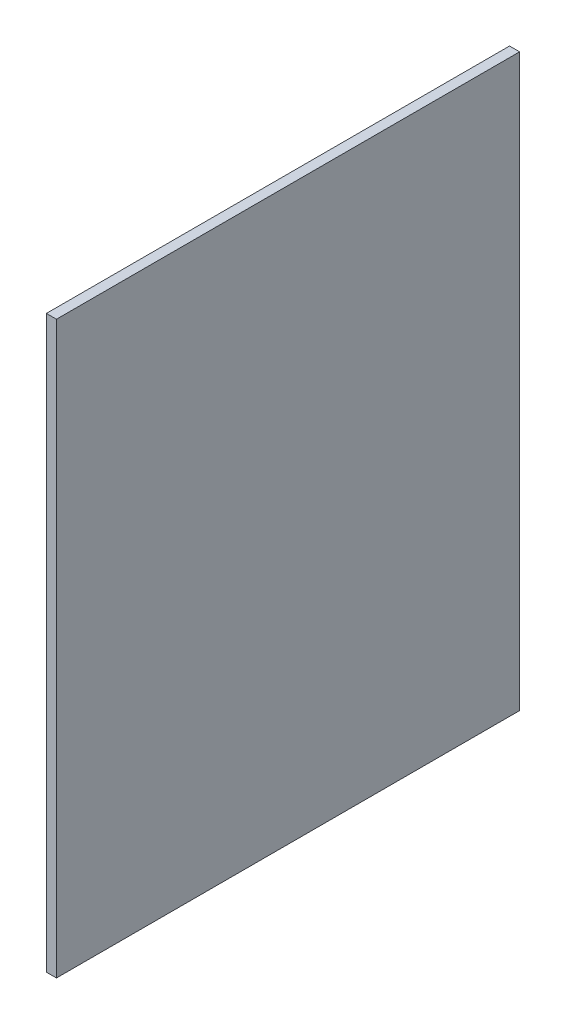
ISO-10303-21;
HEADER;
FILE_DESCRIPTION(('STEP AP214'),'2;1');
FILE_NAME('part.step','',(''),(''),'','','');
FILE_SCHEMA(('AUTOMOTIVE_DESIGN { 1 0 10303 214 1 1 1 1 }'));
ENDSEC;
DATA;
#1=APPLICATION_CONTEXT('core data for automotive mechanical design processes');
#2=APPLICATION_PROTOCOL_DEFINITION('international standard','automotive_design',2000,#1);
#3=PRODUCT_CONTEXT('',#1,'mechanical');
#4=PRODUCT('Part','Part','',(#3));
#5=PRODUCT_RELATED_PRODUCT_CATEGORY('part','',(#4));
#6=PRODUCT_DEFINITION_FORMATION('','',#4);
#7=PRODUCT_DEFINITION_CONTEXT('part definition',#1,'design');
#8=PRODUCT_DEFINITION('design','',#6,#7);
#9=PRODUCT_DEFINITION_SHAPE('','',#8);
#10=(LENGTH_UNIT() NAMED_UNIT(*) SI_UNIT(.MILLI.,.METRE.));
#11=(NAMED_UNIT(*) PLANE_ANGLE_UNIT() SI_UNIT($,.RADIAN.));
#12=(NAMED_UNIT(*) SI_UNIT($,.STERADIAN.) SOLID_ANGLE_UNIT());
#13=UNCERTAINTY_MEASURE_WITH_UNIT(LENGTH_MEASURE(1.E-05),#10,'distance_accuracy_value','');
#14=(GEOMETRIC_REPRESENTATION_CONTEXT(3) GLOBAL_UNCERTAINTY_ASSIGNED_CONTEXT((#13)) GLOBAL_UNIT_ASSIGNED_CONTEXT((#10,
#11,#12)) REPRESENTATION_CONTEXT('',''));
#15=CARTESIAN_POINT('',(0.,0.,0.));
#16=DIRECTION('',(0.,0.,1.));
#17=DIRECTION('',(1.,0.,0.));
#18=AXIS2_PLACEMENT_3D('',#15,#16,#17);
#19=CARTESIAN_POINT('',(19.05,-49.074997150076,36.486986728681));
#20=DIRECTION('',(0.,1.,0.));
#21=DIRECTION('',(0.,0.,1.));
#22=AXIS2_PLACEMENT_3D('',#19,#20,#21);
#23=PLANE('',#22);
#24=DIRECTION('',(0.,0.,-1.));
#25=VECTOR('',#24,1.);
#26=CARTESIAN_POINT('',(0.,-49.074997150076,36.486986728681));
#27=LINE('',#26,#25);
#28=CARTESIAN_POINT('',(0.,-49.074997150076,36.486986728681));
#29=VERTEX_POINT('',#28);
#30=CARTESIAN_POINT('',(0.,-49.074997150076,-839.813013271319));
#31=VERTEX_POINT('',#30);
#32=EDGE_CURVE('E99',#29,#31,#27,.T.);
#33=ORIENTED_EDGE('',*,*,#32,.T.);
#34=DIRECTION('',(-1.,0.,0.));
#35=VECTOR('',#34,1.);
#36=CARTESIAN_POINT('',(19.05,-49.074997150076,-839.813013271319));
#37=LINE('',#36,#35);
#38=CARTESIAN_POINT('',(19.05,-49.074997150076,-839.813013271319));
#39=VERTEX_POINT('',#38);
#40=EDGE_CURVE('E11',#39,#31,#37,.T.);
#41=ORIENTED_EDGE('',*,*,#40,.F.);
#42=DIRECTION('',(0.,0.,-1.));
#43=VECTOR('',#42,1.);
#44=CARTESIAN_POINT('',(19.05,-49.074997150076,36.486986728681));
#45=LINE('',#44,#43);
#46=CARTESIAN_POINT('',(19.05,-49.074997150076,36.486986728681));
#47=VERTEX_POINT('',#46);
#48=EDGE_CURVE('E76',#47,#39,#45,.T.);
#49=ORIENTED_EDGE('',*,*,#48,.F.);
#50=DIRECTION('',(-1.,0.,0.));
#51=VECTOR('',#50,1.);
#52=CARTESIAN_POINT('',(19.05,-49.074997150076,36.486986728681));
#53=LINE('',#52,#51);
#54=EDGE_CURVE('E95',#47,#29,#53,.T.);
#55=ORIENTED_EDGE('',*,*,#54,.T.);
#56=EDGE_LOOP('',(#33,#41,#49,#55));
#57=FACE_BOUND('',#56,.T.);
#58=ADVANCED_FACE('F37',(#57),#23,.F.);
#59=CARTESIAN_POINT('',(19.05,1030.42500284992,-839.813013271319));
#60=DIRECTION('',(0.,0.,-1.));
#61=DIRECTION('',(0.,1.,0.));
#62=AXIS2_PLACEMENT_3D('',#59,#60,#61);
#63=PLANE('',#62);
#64=DIRECTION('',(0.,-1.,0.));
#65=VECTOR('',#64,1.);
#66=CARTESIAN_POINT('',(0.,1030.42500284992,-839.813013271319));
#67=LINE('',#66,#65);
#68=CARTESIAN_POINT('',(0.,1030.42500284992,-839.813013271319));
#69=VERTEX_POINT('',#68);
#70=EDGE_CURVE('E85',#69,#31,#67,.T.);
#71=ORIENTED_EDGE('',*,*,#70,.F.);
#72=DIRECTION('',(-1.,0.,0.));
#73=VECTOR('',#72,1.);
#74=CARTESIAN_POINT('',(19.05,1030.42500284992,-839.813013271319));
#75=LINE('',#74,#73);
#76=CARTESIAN_POINT('',(19.05,1030.42500284992,-839.813013271319));
#77=VERTEX_POINT('',#76);
#78=EDGE_CURVE('E45',#77,#69,#75,.T.);
#79=ORIENTED_EDGE('',*,*,#78,.F.);
#80=DIRECTION('',(0.,-1.,0.));
#81=VECTOR('',#80,1.);
#82=CARTESIAN_POINT('',(19.05,1030.42500284992,-839.813013271319));
#83=LINE('',#82,#81);
#84=EDGE_CURVE('E83',#77,#39,#83,.T.);
#85=ORIENTED_EDGE('',*,*,#84,.T.);
#86=ORIENTED_EDGE('',*,*,#40,.T.);
#87=EDGE_LOOP('',(#71,#79,#85,#86));
#88=FACE_BOUND('',#87,.T.);
#89=ADVANCED_FACE('F82',(#88),#63,.T.);
#90=CARTESIAN_POINT('',(19.05,1030.42500284992,36.4869867286812));
#91=DIRECTION('',(0.,1.,0.));
#92=DIRECTION('',(0.,0.,1.));
#93=AXIS2_PLACEMENT_3D('',#90,#91,#92);
#94=PLANE('',#93);
#95=DIRECTION('',(0.,0.,-1.));
#96=VECTOR('',#95,1.);
#97=CARTESIAN_POINT('',(0.,1030.42500284992,36.4869867286812));
#98=LINE('',#97,#96);
#99=CARTESIAN_POINT('',(0.,1030.42500284992,36.4869867286812));
#100=VERTEX_POINT('',#99);
#101=EDGE_CURVE('E103',#100,#69,#98,.T.);
#102=ORIENTED_EDGE('',*,*,#101,.F.);
#103=DIRECTION('',(-1.,0.,0.));
#104=VECTOR('',#103,1.);
#105=CARTESIAN_POINT('',(19.05,1030.42500284992,36.4869867286812));
#106=LINE('',#105,#104);
#107=CARTESIAN_POINT('',(19.05,1030.42500284992,36.4869867286812));
#108=VERTEX_POINT('',#107);
#109=EDGE_CURVE('E68',#108,#100,#106,.T.);
#110=ORIENTED_EDGE('',*,*,#109,.F.);
#111=DIRECTION('',(0.,0.,-1.));
#112=VECTOR('',#111,1.);
#113=CARTESIAN_POINT('',(19.05,1030.42500284992,36.4869867286812));
#114=LINE('',#113,#112);
#115=EDGE_CURVE('E91',#108,#77,#114,.T.);
#116=ORIENTED_EDGE('',*,*,#115,.T.);
#117=ORIENTED_EDGE('',*,*,#78,.T.);
#118=EDGE_LOOP('',(#102,#110,#116,#117));
#119=FACE_BOUND('',#118,.T.);
#120=ADVANCED_FACE('F93',(#119),#94,.T.);
#121=CARTESIAN_POINT('',(19.05,1030.42500284992,36.4869867286812));
#122=DIRECTION('',(0.,0.,-1.));
#123=DIRECTION('',(0.,1.,0.));
#124=AXIS2_PLACEMENT_3D('',#121,#122,#123);
#125=PLANE('',#124);
#126=DIRECTION('',(0.,-1.,0.));
#127=VECTOR('',#126,1.);
#128=CARTESIAN_POINT('',(0.,1030.42500284992,36.4869867286812));
#129=LINE('',#128,#127);
#130=EDGE_CURVE('E71',#100,#29,#129,.T.);
#131=ORIENTED_EDGE('',*,*,#130,.T.);
#132=ORIENTED_EDGE('',*,*,#54,.F.);
#133=DIRECTION('',(0.,-1.,0.));
#134=VECTOR('',#133,1.);
#135=CARTESIAN_POINT('',(19.05,1030.42500284992,36.4869867286812));
#136=LINE('',#135,#134);
#137=EDGE_CURVE('E53',#108,#47,#136,.T.);
#138=ORIENTED_EDGE('',*,*,#137,.F.);
#139=ORIENTED_EDGE('',*,*,#109,.T.);
#140=EDGE_LOOP('',(#131,#132,#138,#139));
#141=FACE_BOUND('',#140,.T.);
#142=ADVANCED_FACE('F116',(#141),#125,.F.);
#143=CARTESIAN_POINT('',(19.05,0.,0.));
#144=DIRECTION('',(-1.,0.,0.));
#145=DIRECTION('',(0.,0.,1.));
#146=AXIS2_PLACEMENT_3D('',#143,#144,#145);
#147=PLANE('',#146);
#148=ORIENTED_EDGE('',*,*,#48,.T.);
#149=ORIENTED_EDGE('',*,*,#84,.F.);
#150=ORIENTED_EDGE('',*,*,#115,.F.);
#151=ORIENTED_EDGE('',*,*,#137,.T.);
#152=EDGE_LOOP('',(#148,#149,#150,#151));
#153=FACE_BOUND('',#152,.T.);
#154=ADVANCED_FACE('F90',(#153),#147,.F.);
#155=CARTESIAN_POINT('',(0.,0.,0.));
#156=DIRECTION('',(-1.,0.,0.));
#157=DIRECTION('',(0.,0.,1.));
#158=AXIS2_PLACEMENT_3D('',#155,#156,#157);
#159=PLANE('',#158);
#160=ORIENTED_EDGE('',*,*,#32,.F.);
#161=ORIENTED_EDGE('',*,*,#130,.F.);
#162=ORIENTED_EDGE('',*,*,#101,.T.);
#163=ORIENTED_EDGE('',*,*,#70,.T.);
#164=EDGE_LOOP('',(#160,#161,#162,#163));
#165=FACE_BOUND('',#164,.T.);
#166=ADVANCED_FACE('F110',(#165),#159,.T.);
#167=CLOSED_SHELL('',(#58,#89,#120,#142,#154,#166));
#168=MANIFOLD_SOLID_BREP('B2',#167);
#169=ADVANCED_BREP_SHAPE_REPRESENTATION('',(#18,#168),#14);
#170=SHAPE_DEFINITION_REPRESENTATION(#9,#169);
ENDSEC;
END-ISO-10303-21;
